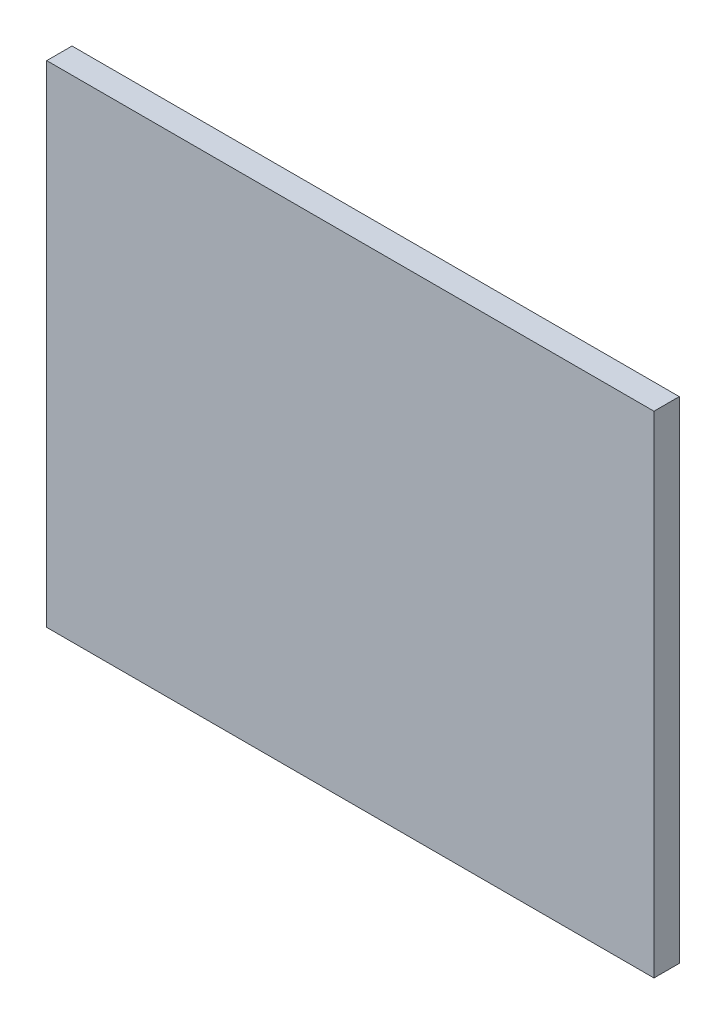
ISO-10303-21;
HEADER;
FILE_DESCRIPTION(('STEP AP214'),'2;1');
FILE_NAME('part.step','',(''),(''),'','','');
FILE_SCHEMA(('AUTOMOTIVE_DESIGN { 1 0 10303 214 1 1 1 1 }'));
ENDSEC;
DATA;
#1=APPLICATION_CONTEXT('core data for automotive mechanical design processes');
#2=APPLICATION_PROTOCOL_DEFINITION('international standard','automotive_design',2000,#1);
#3=PRODUCT_CONTEXT('',#1,'mechanical');
#4=PRODUCT('Part','Part','',(#3));
#5=PRODUCT_RELATED_PRODUCT_CATEGORY('part','',(#4));
#6=PRODUCT_DEFINITION_FORMATION('','',#4);
#7=PRODUCT_DEFINITION_CONTEXT('part definition',#1,'design');
#8=PRODUCT_DEFINITION('design','',#6,#7);
#9=PRODUCT_DEFINITION_SHAPE('','',#8);
#10=(LENGTH_UNIT() NAMED_UNIT(*) SI_UNIT(.MILLI.,.METRE.));
#11=(NAMED_UNIT(*) PLANE_ANGLE_UNIT() SI_UNIT($,.RADIAN.));
#12=(NAMED_UNIT(*) SI_UNIT($,.STERADIAN.) SOLID_ANGLE_UNIT());
#13=UNCERTAINTY_MEASURE_WITH_UNIT(LENGTH_MEASURE(1.E-05),#10,'distance_accuracy_value','');
#14=(GEOMETRIC_REPRESENTATION_CONTEXT(3) GLOBAL_UNCERTAINTY_ASSIGNED_CONTEXT((#13)) GLOBAL_UNIT_ASSIGNED_CONTEXT((#10,
#11,#12)) REPRESENTATION_CONTEXT('',''));
#15=CARTESIAN_POINT('',(0.,0.,0.));
#16=DIRECTION('',(0.,0.,1.));
#17=DIRECTION('',(1.,0.,0.));
#18=AXIS2_PLACEMENT_3D('',#15,#16,#17);
#19=CARTESIAN_POINT('',(-69.0774907749077,40.590405904059,5.));
#20=DIRECTION('',(1.,0.,0.));
#21=DIRECTION('',(0.,1.,0.));
#22=AXIS2_PLACEMENT_3D('',#19,#20,#21);
#23=PLANE('',#22);
#24=DIRECTION('',(0.,-1.,0.));
#25=VECTOR('',#24,1.);
#26=CARTESIAN_POINT('',(-69.0774907749077,40.590405904059,0.));
#27=LINE('',#26,#25);
#28=CARTESIAN_POINT('',(-69.0774907749077,40.590405904059,0.));
#29=VERTEX_POINT('',#28);
#30=CARTESIAN_POINT('',(-69.0774907749077,-56.409594095941,0.));
#31=VERTEX_POINT('',#30);
#32=EDGE_CURVE('E95',#29,#31,#27,.T.);
#33=ORIENTED_EDGE('',*,*,#32,.T.);
#34=DIRECTION('',(0.,0.,-1.));
#35=VECTOR('',#34,1.);
#36=CARTESIAN_POINT('',(-69.0774907749077,-56.409594095941,5.));
#37=LINE('',#36,#35);
#38=CARTESIAN_POINT('',(-69.0774907749077,-56.409594095941,5.));
#39=VERTEX_POINT('',#38);
#40=EDGE_CURVE('E11',#39,#31,#37,.T.);
#41=ORIENTED_EDGE('',*,*,#40,.F.);
#42=DIRECTION('',(0.,-1.,0.));
#43=VECTOR('',#42,1.);
#44=CARTESIAN_POINT('',(-69.0774907749077,40.590405904059,5.));
#45=LINE('',#44,#43);
#46=CARTESIAN_POINT('',(-69.0774907749077,40.590405904059,5.));
#47=VERTEX_POINT('',#46);
#48=EDGE_CURVE('E83',#47,#39,#45,.T.);
#49=ORIENTED_EDGE('',*,*,#48,.F.);
#50=DIRECTION('',(0.,0.,-1.));
#51=VECTOR('',#50,1.);
#52=CARTESIAN_POINT('',(-69.0774907749077,40.590405904059,5.));
#53=LINE('',#52,#51);
#54=EDGE_CURVE('E91',#47,#29,#53,.T.);
#55=ORIENTED_EDGE('',*,*,#54,.T.);
#56=EDGE_LOOP('',(#33,#41,#49,#55));
#57=FACE_BOUND('',#56,.T.);
#58=ADVANCED_FACE('F32',(#57),#23,.F.);
#59=CARTESIAN_POINT('',(-69.0774907749077,-56.409594095941,5.));
#60=DIRECTION('',(0.,1.,0.));
#61=DIRECTION('',(0.,0.,1.));
#62=AXIS2_PLACEMENT_3D('',#59,#60,#61);
#63=PLANE('',#62);
#64=DIRECTION('',(1.,0.,0.));
#65=VECTOR('',#64,1.);
#66=CARTESIAN_POINT('',(-69.0774907749077,-56.409594095941,0.));
#67=LINE('',#66,#65);
#68=CARTESIAN_POINT('',(50.9225092250923,-56.409594095941,0.));
#69=VERTEX_POINT('',#68);
#70=EDGE_CURVE('E87',#31,#69,#67,.T.);
#71=ORIENTED_EDGE('',*,*,#70,.T.);
#72=DIRECTION('',(0.,0.,-1.));
#73=VECTOR('',#72,1.);
#74=CARTESIAN_POINT('',(50.9225092250923,-56.409594095941,5.));
#75=LINE('',#74,#73);
#76=CARTESIAN_POINT('',(50.9225092250923,-56.409594095941,5.));
#77=VERTEX_POINT('',#76);
#78=EDGE_CURVE('E40',#77,#69,#75,.T.);
#79=ORIENTED_EDGE('',*,*,#78,.F.);
#80=DIRECTION('',(1.,0.,0.));
#81=VECTOR('',#80,1.);
#82=CARTESIAN_POINT('',(-69.0774907749077,-56.409594095941,5.));
#83=LINE('',#82,#81);
#84=EDGE_CURVE('E78',#39,#77,#83,.T.);
#85=ORIENTED_EDGE('',*,*,#84,.F.);
#86=ORIENTED_EDGE('',*,*,#40,.T.);
#87=EDGE_LOOP('',(#71,#79,#85,#86));
#88=FACE_BOUND('',#87,.T.);
#89=ADVANCED_FACE('F86',(#88),#63,.F.);
#90=CARTESIAN_POINT('',(50.9225092250923,40.590405904059,5.));
#91=DIRECTION('',(-1.,0.,0.));
#92=DIRECTION('',(0.,-1.,0.));
#93=AXIS2_PLACEMENT_3D('',#90,#91,#92);
#94=PLANE('',#93);
#95=DIRECTION('',(0.,1.,0.));
#96=VECTOR('',#95,1.);
#97=CARTESIAN_POINT('',(50.9225092250923,40.590405904059,0.));
#98=LINE('',#97,#96);
#99=CARTESIAN_POINT('',(50.9225092250923,40.590405904059,0.));
#100=VERTEX_POINT('',#99);
#101=EDGE_CURVE('E65',#69,#100,#98,.T.);
#102=ORIENTED_EDGE('',*,*,#101,.T.);
#103=DIRECTION('',(0.,0.,-1.));
#104=VECTOR('',#103,1.);
#105=CARTESIAN_POINT('',(50.9225092250923,40.590405904059,5.));
#106=LINE('',#105,#104);
#107=CARTESIAN_POINT('',(50.9225092250923,40.590405904059,5.));
#108=VERTEX_POINT('',#107);
#109=EDGE_CURVE('E88',#108,#100,#106,.T.);
#110=ORIENTED_EDGE('',*,*,#109,.F.);
#111=DIRECTION('',(0.,1.,0.));
#112=VECTOR('',#111,1.);
#113=CARTESIAN_POINT('',(50.9225092250923,40.590405904059,5.));
#114=LINE('',#113,#112);
#115=EDGE_CURVE('E81',#77,#108,#114,.T.);
#116=ORIENTED_EDGE('',*,*,#115,.F.);
#117=ORIENTED_EDGE('',*,*,#78,.T.);
#118=EDGE_LOOP('',(#102,#110,#116,#117));
#119=FACE_BOUND('',#118,.T.);
#120=ADVANCED_FACE('F89',(#119),#94,.F.);
#121=CARTESIAN_POINT('',(-69.0774907749077,40.590405904059,5.));
#122=DIRECTION('',(0.,-1.,0.));
#123=DIRECTION('',(0.,0.,-1.));
#124=AXIS2_PLACEMENT_3D('',#121,#122,#123);
#125=PLANE('',#124);
#126=DIRECTION('',(-1.,0.,0.));
#127=VECTOR('',#126,1.);
#128=CARTESIAN_POINT('',(-69.0774907749077,40.590405904059,0.));
#129=LINE('',#128,#127);
#130=EDGE_CURVE('E71',#100,#29,#129,.T.);
#131=ORIENTED_EDGE('',*,*,#130,.T.);
#132=ORIENTED_EDGE('',*,*,#54,.F.);
#133=DIRECTION('',(-1.,0.,0.));
#134=VECTOR('',#133,1.);
#135=CARTESIAN_POINT('',(-69.0774907749077,40.590405904059,5.));
#136=LINE('',#135,#134);
#137=EDGE_CURVE('E48',#108,#47,#136,.T.);
#138=ORIENTED_EDGE('',*,*,#137,.F.);
#139=ORIENTED_EDGE('',*,*,#109,.T.);
#140=EDGE_LOOP('',(#131,#132,#138,#139));
#141=FACE_BOUND('',#140,.T.);
#142=ADVANCED_FACE('F102',(#141),#125,.F.);
#143=CARTESIAN_POINT('',(0.,0.,5.));
#144=DIRECTION('',(0.,0.,1.));
#145=DIRECTION('',(1.,0.,0.));
#146=AXIS2_PLACEMENT_3D('',#143,#144,#145);
#147=PLANE('',#146);
#148=ORIENTED_EDGE('',*,*,#48,.T.);
#149=ORIENTED_EDGE('',*,*,#84,.T.);
#150=ORIENTED_EDGE('',*,*,#115,.T.);
#151=ORIENTED_EDGE('',*,*,#137,.T.);
#152=EDGE_LOOP('',(#148,#149,#150,#151));
#153=FACE_BOUND('',#152,.T.);
#154=ADVANCED_FACE('F79',(#153),#147,.T.);
#155=CARTESIAN_POINT('',(0.,0.,0.));
#156=DIRECTION('',(0.,0.,1.));
#157=DIRECTION('',(1.,0.,0.));
#158=AXIS2_PLACEMENT_3D('',#155,#156,#157);
#159=PLANE('',#158);
#160=ORIENTED_EDGE('',*,*,#32,.F.);
#161=ORIENTED_EDGE('',*,*,#130,.F.);
#162=ORIENTED_EDGE('',*,*,#101,.F.);
#163=ORIENTED_EDGE('',*,*,#70,.F.);
#164=EDGE_LOOP('',(#160,#161,#162,#163));
#165=FACE_BOUND('',#164,.T.);
#166=ADVANCED_FACE('F105',(#165),#159,.F.);
#167=CLOSED_SHELL('',(#58,#89,#120,#142,#154,#166));
#168=MANIFOLD_SOLID_BREP('B2',#167);
#169=ADVANCED_BREP_SHAPE_REPRESENTATION('',(#18,#168),#14);
#170=SHAPE_DEFINITION_REPRESENTATION(#9,#169);
ENDSEC;
END-ISO-10303-21;
